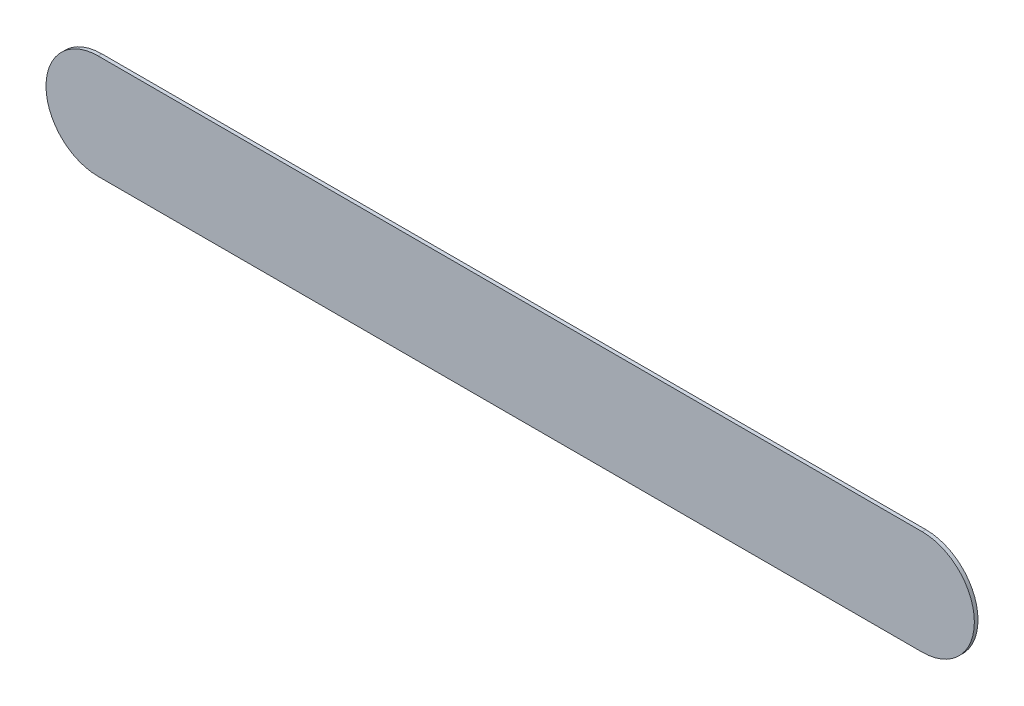
ISO-10303-21;
HEADER;
FILE_DESCRIPTION(('STEP AP214'),'2;1');
FILE_NAME('part.step','',(''),(''),'','','');
FILE_SCHEMA(('AUTOMOTIVE_DESIGN { 1 0 10303 214 1 1 1 1 }'));
ENDSEC;
DATA;
#1=APPLICATION_CONTEXT('core data for automotive mechanical design processes');
#2=APPLICATION_PROTOCOL_DEFINITION('international standard','automotive_design',2000,#1);
#3=PRODUCT_CONTEXT('',#1,'mechanical');
#4=PRODUCT('Part','Part','',(#3));
#5=PRODUCT_RELATED_PRODUCT_CATEGORY('part','',(#4));
#6=PRODUCT_DEFINITION_FORMATION('','',#4);
#7=PRODUCT_DEFINITION_CONTEXT('part definition',#1,'design');
#8=PRODUCT_DEFINITION('design','',#6,#7);
#9=PRODUCT_DEFINITION_SHAPE('','',#8);
#10=(LENGTH_UNIT() NAMED_UNIT(*) SI_UNIT(.MILLI.,.METRE.));
#11=(NAMED_UNIT(*) PLANE_ANGLE_UNIT() SI_UNIT($,.RADIAN.));
#12=(NAMED_UNIT(*) SI_UNIT($,.STERADIAN.) SOLID_ANGLE_UNIT());
#13=UNCERTAINTY_MEASURE_WITH_UNIT(LENGTH_MEASURE(1.E-05),#10,'distance_accuracy_value','');
#14=(GEOMETRIC_REPRESENTATION_CONTEXT(3) GLOBAL_UNCERTAINTY_ASSIGNED_CONTEXT((#13)) GLOBAL_UNIT_ASSIGNED_CONTEXT((#10,
#11,#12)) REPRESENTATION_CONTEXT('',''));
#15=CARTESIAN_POINT('',(0.,0.,0.));
#16=DIRECTION('',(0.,0.,1.));
#17=DIRECTION('',(1.,0.,0.));
#18=AXIS2_PLACEMENT_3D('',#15,#16,#17);
#19=CARTESIAN_POINT('',(109.919,-74.605,1.635));
#20=DIRECTION('',(0.,0.,1.));
#21=DIRECTION('',(1.,0.,0.));
#22=AXIS2_PLACEMENT_3D('',#19,#20,#21);
#23=PLANE('',#22);
#24=DIRECTION('',(1.,0.,0.));
#25=VECTOR('',#24,1.);
#26=CARTESIAN_POINT('',(109.919,-74.605,1.635));
#27=LINE('',#26,#25);
#28=CARTESIAN_POINT('',(109.919,-74.605,1.635));
#29=VERTEX_POINT('',#28);
#30=CARTESIAN_POINT('',(117.815,-74.605,1.635));
#31=VERTEX_POINT('',#30);
#32=EDGE_CURVE('E89',#29,#31,#27,.T.);
#33=ORIENTED_EDGE('',*,*,#32,.T.);
#34=CARTESIAN_POINT('',(117.815,-74.105,1.635));
#35=DIRECTION('',(0.,0.,1.));
#36=DIRECTION('',(0.,-1.,0.));
#37=AXIS2_PLACEMENT_3D('',#34,#35,#36);
#38=CIRCLE('',#37,0.5);
#39=CARTESIAN_POINT('',(117.815,-73.605,1.635));
#40=VERTEX_POINT('',#39);
#41=EDGE_CURVE('E105',#31,#40,#38,.T.);
#42=ORIENTED_EDGE('',*,*,#41,.T.);
#43=DIRECTION('',(-1.,0.,0.));
#44=VECTOR('',#43,1.);
#45=CARTESIAN_POINT('',(117.815,-73.605,1.635));
#46=LINE('',#45,#44);
#47=CARTESIAN_POINT('',(109.919,-73.605,1.635));
#48=VERTEX_POINT('',#47);
#49=EDGE_CURVE('E51',#40,#48,#46,.T.);
#50=ORIENTED_EDGE('',*,*,#49,.T.);
#51=CARTESIAN_POINT('',(109.919,-74.105,1.635));
#52=DIRECTION('',(0.,0.,1.));
#53=DIRECTION('',(0.,1.,0.));
#54=AXIS2_PLACEMENT_3D('',#51,#52,#53);
#55=CIRCLE('',#54,0.5);
#56=EDGE_CURVE('E11',#48,#29,#55,.T.);
#57=ORIENTED_EDGE('',*,*,#56,.T.);
#58=EDGE_LOOP('',(#33,#42,#50,#57));
#59=FACE_BOUND('',#58,.T.);
#60=ADVANCED_FACE('F17',(#59),#23,.T.);
#61=CARTESIAN_POINT('',(109.919,-74.605,1.6));
#62=DIRECTION('',(0.,0.,1.));
#63=DIRECTION('',(1.,0.,0.));
#64=AXIS2_PLACEMENT_3D('',#61,#62,#63);
#65=PLANE('',#64);
#66=CARTESIAN_POINT('',(109.919,-74.105,1.6));
#67=DIRECTION('',(0.,0.,1.));
#68=DIRECTION('',(0.,1.,0.));
#69=AXIS2_PLACEMENT_3D('',#66,#67,#68);
#70=CIRCLE('',#69,0.5);
#71=CARTESIAN_POINT('',(109.919,-73.605,1.6));
#72=VERTEX_POINT('',#71);
#73=CARTESIAN_POINT('',(109.919,-74.605,1.6));
#74=VERTEX_POINT('',#73);
#75=EDGE_CURVE('E27',#72,#74,#70,.T.);
#76=ORIENTED_EDGE('',*,*,#75,.F.);
#77=DIRECTION('',(-1.,0.,0.));
#78=VECTOR('',#77,1.);
#79=CARTESIAN_POINT('',(117.815,-73.605,1.6));
#80=LINE('',#79,#78);
#81=CARTESIAN_POINT('',(117.815,-73.605,1.6));
#82=VERTEX_POINT('',#81);
#83=EDGE_CURVE('E60',#82,#72,#80,.T.);
#84=ORIENTED_EDGE('',*,*,#83,.F.);
#85=CARTESIAN_POINT('',(117.815,-74.105,1.6));
#86=DIRECTION('',(0.,0.,1.));
#87=DIRECTION('',(0.,-1.,0.));
#88=AXIS2_PLACEMENT_3D('',#85,#86,#87);
#89=CIRCLE('',#88,0.5);
#90=CARTESIAN_POINT('',(117.815,-74.605,1.6));
#91=VERTEX_POINT('',#90);
#92=EDGE_CURVE('E91',#91,#82,#89,.T.);
#93=ORIENTED_EDGE('',*,*,#92,.F.);
#94=DIRECTION('',(1.,0.,0.));
#95=VECTOR('',#94,1.);
#96=CARTESIAN_POINT('',(109.919,-74.605,1.6));
#97=LINE('',#96,#95);
#98=EDGE_CURVE('E88',#74,#91,#97,.T.);
#99=ORIENTED_EDGE('',*,*,#98,.F.);
#100=EDGE_LOOP('',(#76,#84,#93,#99));
#101=FACE_BOUND('',#100,.T.);
#102=ADVANCED_FACE('F93',(#101),#65,.F.);
#103=CARTESIAN_POINT('',(109.919,-74.105,1.6));
#104=DIRECTION('',(0.,0.,-1.));
#105=DIRECTION('',(0.,1.,0.));
#106=AXIS2_PLACEMENT_3D('',#103,#104,#105);
#107=CYLINDRICAL_SURFACE('',#106,0.5);
#108=ORIENTED_EDGE('',*,*,#75,.T.);
#109=DIRECTION('',(0.,0.,1.));
#110=VECTOR('',#109,1.);
#111=CARTESIAN_POINT('',(109.919,-74.605,1.6));
#112=LINE('',#111,#110);
#113=EDGE_CURVE('E79',#74,#29,#112,.T.);
#114=ORIENTED_EDGE('',*,*,#113,.T.);
#115=ORIENTED_EDGE('',*,*,#56,.F.);
#116=DIRECTION('',(0.,0.,1.));
#117=VECTOR('',#116,1.);
#118=CARTESIAN_POINT('',(109.919,-73.605,1.6));
#119=LINE('',#118,#117);
#120=EDGE_CURVE('E20',#72,#48,#119,.T.);
#121=ORIENTED_EDGE('',*,*,#120,.F.);
#122=EDGE_LOOP('',(#108,#114,#115,#121));
#123=FACE_BOUND('',#122,.T.);
#124=ADVANCED_FACE('F78',(#123),#107,.T.);
#125=CARTESIAN_POINT('',(117.815,-73.605,1.6));
#126=DIRECTION('',(0.,-1.,0.));
#127=DIRECTION('',(0.,0.,-1.));
#128=AXIS2_PLACEMENT_3D('',#125,#126,#127);
#129=PLANE('',#128);
#130=ORIENTED_EDGE('',*,*,#83,.T.);
#131=ORIENTED_EDGE('',*,*,#120,.T.);
#132=ORIENTED_EDGE('',*,*,#49,.F.);
#133=DIRECTION('',(0.,0.,1.));
#134=VECTOR('',#133,1.);
#135=CARTESIAN_POINT('',(117.815,-73.605,1.6));
#136=LINE('',#135,#134);
#137=EDGE_CURVE('E107',#82,#40,#136,.T.);
#138=ORIENTED_EDGE('',*,*,#137,.F.);
#139=EDGE_LOOP('',(#130,#131,#132,#138));
#140=FACE_BOUND('',#139,.T.);
#141=ADVANCED_FACE('F123',(#140),#129,.F.);
#142=CARTESIAN_POINT('',(117.815,-74.105,1.6));
#143=DIRECTION('',(0.,0.,-1.));
#144=DIRECTION('',(0.,-1.,0.));
#145=AXIS2_PLACEMENT_3D('',#142,#143,#144);
#146=CYLINDRICAL_SURFACE('',#145,0.5);
#147=ORIENTED_EDGE('',*,*,#92,.T.);
#148=ORIENTED_EDGE('',*,*,#137,.T.);
#149=ORIENTED_EDGE('',*,*,#41,.F.);
#150=DIRECTION('',(0.,0.,1.));
#151=VECTOR('',#150,1.);
#152=CARTESIAN_POINT('',(117.815,-74.605,1.6));
#153=LINE('',#152,#151);
#154=EDGE_CURVE('E97',#91,#31,#153,.T.);
#155=ORIENTED_EDGE('',*,*,#154,.F.);
#156=EDGE_LOOP('',(#147,#148,#149,#155));
#157=FACE_BOUND('',#156,.T.);
#158=ADVANCED_FACE('F125',(#157),#146,.T.);
#159=CARTESIAN_POINT('',(109.919,-74.605,1.6));
#160=DIRECTION('',(0.,1.,0.));
#161=DIRECTION('',(1.,0.,0.));
#162=AXIS2_PLACEMENT_3D('',#159,#160,#161);
#163=PLANE('',#162);
#164=ORIENTED_EDGE('',*,*,#98,.T.);
#165=ORIENTED_EDGE('',*,*,#154,.T.);
#166=ORIENTED_EDGE('',*,*,#32,.F.);
#167=ORIENTED_EDGE('',*,*,#113,.F.);
#168=EDGE_LOOP('',(#164,#165,#166,#167));
#169=FACE_BOUND('',#168,.T.);
#170=ADVANCED_FACE('F86',(#169),#163,.F.);
#171=CLOSED_SHELL('',(#60,#102,#124,#141,#158,#170));
#172=MANIFOLD_SOLID_BREP('B1',#171);
#173=ADVANCED_BREP_SHAPE_REPRESENTATION('',(#18,#172),#14);
#174=SHAPE_DEFINITION_REPRESENTATION(#9,#173);
ENDSEC;
END-ISO-10303-21;
